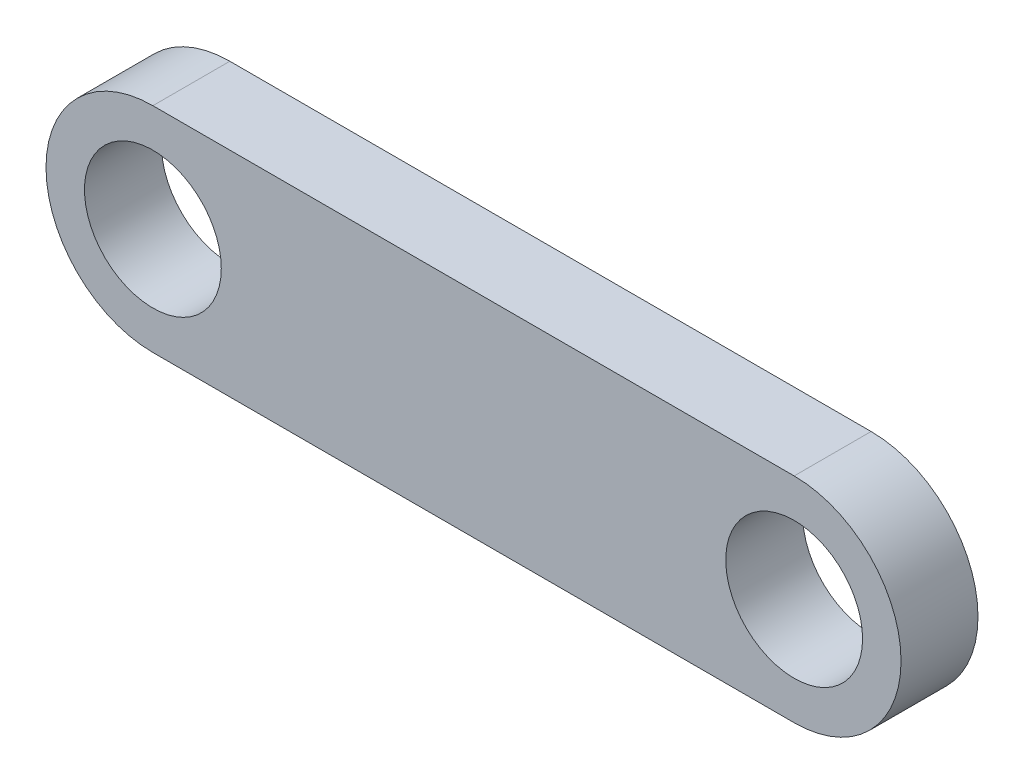
ISO-10303-21;
HEADER;
FILE_DESCRIPTION(('STEP AP214'),'2;1');
FILE_NAME('part.step','',(''),(''),'','','');
FILE_SCHEMA(('AUTOMOTIVE_DESIGN { 1 0 10303 214 1 1 1 1 }'));
ENDSEC;
DATA;
#1=APPLICATION_CONTEXT('core data for automotive mechanical design processes');
#2=APPLICATION_PROTOCOL_DEFINITION('international standard','automotive_design',2000,#1);
#3=PRODUCT_CONTEXT('',#1,'mechanical');
#4=PRODUCT('Part','Part','',(#3));
#5=PRODUCT_RELATED_PRODUCT_CATEGORY('part','',(#4));
#6=PRODUCT_DEFINITION_FORMATION('','',#4);
#7=PRODUCT_DEFINITION_CONTEXT('part definition',#1,'design');
#8=PRODUCT_DEFINITION('design','',#6,#7);
#9=PRODUCT_DEFINITION_SHAPE('','',#8);
#10=(LENGTH_UNIT() NAMED_UNIT(*) SI_UNIT(.MILLI.,.METRE.));
#11=(NAMED_UNIT(*) PLANE_ANGLE_UNIT() SI_UNIT($,.RADIAN.));
#12=(NAMED_UNIT(*) SI_UNIT($,.STERADIAN.) SOLID_ANGLE_UNIT());
#13=UNCERTAINTY_MEASURE_WITH_UNIT(LENGTH_MEASURE(1.E-05),#10,'distance_accuracy_value','');
#14=(GEOMETRIC_REPRESENTATION_CONTEXT(3) GLOBAL_UNCERTAINTY_ASSIGNED_CONTEXT((#13)) GLOBAL_UNIT_ASSIGNED_CONTEXT((#10,
#11,#12)) REPRESENTATION_CONTEXT('',''));
#15=CARTESIAN_POINT('',(0.,0.,0.));
#16=DIRECTION('',(0.,0.,1.));
#17=DIRECTION('',(1.,0.,0.));
#18=AXIS2_PLACEMENT_3D('',#15,#16,#17);
#19=CARTESIAN_POINT('',(0.,-1.5,-0.9));
#20=DIRECTION('',(0.,1.,0.));
#21=DIRECTION('',(0.,0.,1.));
#22=AXIS2_PLACEMENT_3D('',#19,#20,#21);
#23=PLANE('',#22);
#24=DIRECTION('',(0.,0.,1.));
#25=VECTOR('',#24,1.);
#26=CARTESIAN_POINT('',(7.5,-1.5,-0.9));
#27=LINE('',#26,#25);
#28=CARTESIAN_POINT('',(7.5,-1.5,-0.9));
#29=VERTEX_POINT('',#28);
#30=CARTESIAN_POINT('',(7.5,-1.5,0.9));
#31=VERTEX_POINT('',#30);
#32=EDGE_CURVE('E38',#29,#31,#27,.T.);
#33=ORIENTED_EDGE('',*,*,#32,.T.);
#34=DIRECTION('',(-1.,0.,0.));
#35=VECTOR('',#34,1.);
#36=CARTESIAN_POINT('',(0.,-1.5,0.9));
#37=LINE('',#36,#35);
#38=CARTESIAN_POINT('',(-7.5,-1.5,0.9));
#39=VERTEX_POINT('',#38);
#40=EDGE_CURVE('E79',#31,#39,#37,.T.);
#41=ORIENTED_EDGE('',*,*,#40,.T.);
#42=DIRECTION('',(0.,0.,1.));
#43=VECTOR('',#42,1.);
#44=CARTESIAN_POINT('',(-7.5,-1.5,-0.9));
#45=LINE('',#44,#43);
#46=CARTESIAN_POINT('',(-7.5,-1.5,-0.9));
#47=VERTEX_POINT('',#46);
#48=EDGE_CURVE('E11',#47,#39,#45,.T.);
#49=ORIENTED_EDGE('',*,*,#48,.F.);
#50=DIRECTION('',(-1.,0.,0.));
#51=VECTOR('',#50,1.);
#52=CARTESIAN_POINT('',(0.,-1.5,-0.9));
#53=LINE('',#52,#51);
#54=EDGE_CURVE('E51',#29,#47,#53,.T.);
#55=ORIENTED_EDGE('',*,*,#54,.F.);
#56=EDGE_LOOP('',(#33,#41,#49,#55));
#57=FACE_BOUND('',#56,.T.);
#58=ADVANCED_FACE('F35',(#57),#23,.F.);
#59=CARTESIAN_POINT('',(-7.5,1.,-0.9));
#60=DIRECTION('',(0.,0.,1.));
#61=DIRECTION('',(1.,0.,0.));
#62=AXIS2_PLACEMENT_3D('',#59,#60,#61);
#63=CYLINDRICAL_SURFACE('',#62,2.5);
#64=ORIENTED_EDGE('',*,*,#48,.T.);
#65=CARTESIAN_POINT('',(-7.5,1.,0.9));
#66=DIRECTION('',(0.,0.,1.));
#67=DIRECTION('',(1.,0.,0.));
#68=AXIS2_PLACEMENT_3D('',#65,#66,#67);
#69=CIRCLE('',#68,2.5);
#70=CARTESIAN_POINT('',(-7.5,3.5,0.9));
#71=VERTEX_POINT('',#70);
#72=EDGE_CURVE('E96',#71,#39,#69,.T.);
#73=ORIENTED_EDGE('',*,*,#72,.F.);
#74=DIRECTION('',(0.,0.,1.));
#75=VECTOR('',#74,1.);
#76=CARTESIAN_POINT('',(-7.5,3.5,-0.9));
#77=LINE('',#76,#75);
#78=CARTESIAN_POINT('',(-7.5,3.5,-0.9));
#79=VERTEX_POINT('',#78);
#80=EDGE_CURVE('E43',#79,#71,#77,.T.);
#81=ORIENTED_EDGE('',*,*,#80,.F.);
#82=CARTESIAN_POINT('',(-7.5,1.,-0.9));
#83=DIRECTION('',(0.,0.,1.));
#84=DIRECTION('',(1.,0.,0.));
#85=AXIS2_PLACEMENT_3D('',#82,#83,#84);
#86=CIRCLE('',#85,2.5);
#87=EDGE_CURVE('E112',#79,#47,#86,.T.);
#88=ORIENTED_EDGE('',*,*,#87,.T.);
#89=EDGE_LOOP('',(#64,#73,#81,#88));
#90=FACE_BOUND('',#89,.T.);
#91=ADVANCED_FACE('F121',(#90),#63,.T.);
#92=CARTESIAN_POINT('',(0.,3.5,-0.9));
#93=DIRECTION('',(0.,-1.,0.));
#94=DIRECTION('',(1.,0.,0.));
#95=AXIS2_PLACEMENT_3D('',#92,#93,#94);
#96=PLANE('',#95);
#97=ORIENTED_EDGE('',*,*,#80,.T.);
#98=DIRECTION('',(1.,0.,0.));
#99=VECTOR('',#98,1.);
#100=CARTESIAN_POINT('',(0.,3.5,0.9));
#101=LINE('',#100,#99);
#102=CARTESIAN_POINT('',(7.5,3.5,0.9));
#103=VERTEX_POINT('',#102);
#104=EDGE_CURVE('E91',#71,#103,#101,.T.);
#105=ORIENTED_EDGE('',*,*,#104,.T.);
#106=DIRECTION('',(0.,0.,1.));
#107=VECTOR('',#106,1.);
#108=CARTESIAN_POINT('',(7.5,3.5,-0.9));
#109=LINE('',#108,#107);
#110=CARTESIAN_POINT('',(7.5,3.5,-0.9));
#111=VERTEX_POINT('',#110);
#112=EDGE_CURVE('E82',#111,#103,#109,.T.);
#113=ORIENTED_EDGE('',*,*,#112,.F.);
#114=DIRECTION('',(1.,0.,0.));
#115=VECTOR('',#114,1.);
#116=CARTESIAN_POINT('',(0.,3.5,-0.9));
#117=LINE('',#116,#115);
#118=EDGE_CURVE('E110',#79,#111,#117,.T.);
#119=ORIENTED_EDGE('',*,*,#118,.F.);
#120=EDGE_LOOP('',(#97,#105,#113,#119));
#121=FACE_BOUND('',#120,.T.);
#122=ADVANCED_FACE('F120',(#121),#96,.F.);
#123=CARTESIAN_POINT('',(-7.5,1.,-0.9));
#124=DIRECTION('',(0.,0.,1.));
#125=DIRECTION('',(1.,0.,0.));
#126=AXIS2_PLACEMENT_3D('',#123,#124,#125);
#127=CYLINDRICAL_SURFACE('',#126,1.6);
#128=CARTESIAN_POINT('',(-7.5,1.,-0.9));
#129=DIRECTION('',(0.,0.,1.));
#130=DIRECTION('',(1.,0.,0.));
#131=AXIS2_PLACEMENT_3D('',#128,#129,#130);
#132=CIRCLE('',#131,1.6);
#133=CARTESIAN_POINT('',(-5.9,1.,-0.9));
#134=VERTEX_POINT('',#133);
#135=EDGE_CURVE('E114',#134,#134,#132,.T.);
#136=ORIENTED_EDGE('',*,*,#135,.F.);
#137=EDGE_LOOP('',(#136));
#138=FACE_BOUND('',#137,.T.);
#139=CARTESIAN_POINT('',(-7.5,1.,0.9));
#140=DIRECTION('',(0.,0.,1.));
#141=DIRECTION('',(1.,0.,0.));
#142=AXIS2_PLACEMENT_3D('',#139,#140,#141);
#143=CIRCLE('',#142,1.6);
#144=CARTESIAN_POINT('',(-5.9,1.,0.9));
#145=VERTEX_POINT('',#144);
#146=EDGE_CURVE('E101',#145,#145,#143,.T.);
#147=ORIENTED_EDGE('',*,*,#146,.T.);
#148=EDGE_LOOP('',(#147));
#149=FACE_BOUND('',#148,.T.);
#150=ADVANCED_FACE('F148',(#138,#149),#127,.F.);
#151=CARTESIAN_POINT('',(7.5,1.,-0.9));
#152=DIRECTION('',(0.,0.,1.));
#153=DIRECTION('',(1.,0.,0.));
#154=AXIS2_PLACEMENT_3D('',#151,#152,#153);
#155=CYLINDRICAL_SURFACE('',#154,2.5);
#156=ORIENTED_EDGE('',*,*,#112,.T.);
#157=CARTESIAN_POINT('',(7.5,1.,0.9));
#158=DIRECTION('',(0.,0.,1.));
#159=DIRECTION('',(1.,0.,0.));
#160=AXIS2_PLACEMENT_3D('',#157,#158,#159);
#161=CIRCLE('',#160,2.5);
#162=EDGE_CURVE('E85',#31,#103,#161,.T.);
#163=ORIENTED_EDGE('',*,*,#162,.F.);
#164=ORIENTED_EDGE('',*,*,#32,.F.);
#165=CARTESIAN_POINT('',(7.5,1.,-0.9));
#166=DIRECTION('',(0.,0.,1.));
#167=DIRECTION('',(1.,0.,0.));
#168=AXIS2_PLACEMENT_3D('',#165,#166,#167);
#169=CIRCLE('',#168,2.5);
#170=EDGE_CURVE('E108',#29,#111,#169,.T.);
#171=ORIENTED_EDGE('',*,*,#170,.T.);
#172=EDGE_LOOP('',(#156,#163,#164,#171));
#173=FACE_BOUND('',#172,.T.);
#174=ADVANCED_FACE('F86',(#173),#155,.T.);
#175=CARTESIAN_POINT('',(7.5,1.,-0.9));
#176=DIRECTION('',(0.,0.,1.));
#177=DIRECTION('',(1.,0.,0.));
#178=AXIS2_PLACEMENT_3D('',#175,#176,#177);
#179=CYLINDRICAL_SURFACE('',#178,1.6);
#180=CARTESIAN_POINT('',(7.5,1.,-0.9));
#181=DIRECTION('',(0.,0.,1.));
#182=DIRECTION('',(1.,0.,0.));
#183=AXIS2_PLACEMENT_3D('',#180,#181,#182);
#184=CIRCLE('',#183,1.6);
#185=CARTESIAN_POINT('',(9.1,1.,-0.9));
#186=VERTEX_POINT('',#185);
#187=EDGE_CURVE('E83',#186,#186,#184,.T.);
#188=ORIENTED_EDGE('',*,*,#187,.F.);
#189=EDGE_LOOP('',(#188));
#190=FACE_BOUND('',#189,.T.);
#191=CARTESIAN_POINT('',(7.5,1.,0.9));
#192=DIRECTION('',(0.,0.,1.));
#193=DIRECTION('',(1.,0.,0.));
#194=AXIS2_PLACEMENT_3D('',#191,#192,#193);
#195=CIRCLE('',#194,1.6);
#196=CARTESIAN_POINT('',(9.1,1.,0.9));
#197=VERTEX_POINT('',#196);
#198=EDGE_CURVE('E104',#197,#197,#195,.T.);
#199=ORIENTED_EDGE('',*,*,#198,.T.);
#200=EDGE_LOOP('',(#199));
#201=FACE_BOUND('',#200,.T.);
#202=ADVANCED_FACE('F125',(#190,#201),#179,.F.);
#203=CARTESIAN_POINT('',(0.,0.,-0.9));
#204=DIRECTION('',(0.,0.,1.));
#205=DIRECTION('',(1.,0.,0.));
#206=AXIS2_PLACEMENT_3D('',#203,#204,#205);
#207=PLANE('',#206);
#208=ORIENTED_EDGE('',*,*,#54,.T.);
#209=ORIENTED_EDGE('',*,*,#87,.F.);
#210=ORIENTED_EDGE('',*,*,#118,.T.);
#211=ORIENTED_EDGE('',*,*,#170,.F.);
#212=EDGE_LOOP('',(#208,#209,#210,#211));
#213=FACE_BOUND('',#212,.T.);
#214=ORIENTED_EDGE('',*,*,#135,.T.);
#215=EDGE_LOOP('',(#214));
#216=FACE_BOUND('',#215,.T.);
#217=ORIENTED_EDGE('',*,*,#187,.T.);
#218=EDGE_LOOP('',(#217));
#219=FACE_BOUND('',#218,.T.);
#220=ADVANCED_FACE('F122',(#213,#216,#219),#207,.F.);
#221=CARTESIAN_POINT('',(0.,0.,0.9));
#222=DIRECTION('',(0.,0.,1.));
#223=DIRECTION('',(1.,0.,0.));
#224=AXIS2_PLACEMENT_3D('',#221,#222,#223);
#225=PLANE('',#224);
#226=ORIENTED_EDGE('',*,*,#40,.F.);
#227=ORIENTED_EDGE('',*,*,#162,.T.);
#228=ORIENTED_EDGE('',*,*,#104,.F.);
#229=ORIENTED_EDGE('',*,*,#72,.T.);
#230=EDGE_LOOP('',(#226,#227,#228,#229));
#231=FACE_BOUND('',#230,.T.);
#232=ORIENTED_EDGE('',*,*,#146,.F.);
#233=EDGE_LOOP('',(#232));
#234=FACE_BOUND('',#233,.T.);
#235=ORIENTED_EDGE('',*,*,#198,.F.);
#236=EDGE_LOOP('',(#235));
#237=FACE_BOUND('',#236,.T.);
#238=ADVANCED_FACE('F94',(#231,#234,#237),#225,.T.);
#239=CLOSED_SHELL('',(#58,#91,#122,#150,#174,#202,#220,#238));
#240=MANIFOLD_SOLID_BREP('B2',#239);
#241=ADVANCED_BREP_SHAPE_REPRESENTATION('',(#18,#240),#14);
#242=SHAPE_DEFINITION_REPRESENTATION(#9,#241);
ENDSEC;
END-ISO-10303-21;
